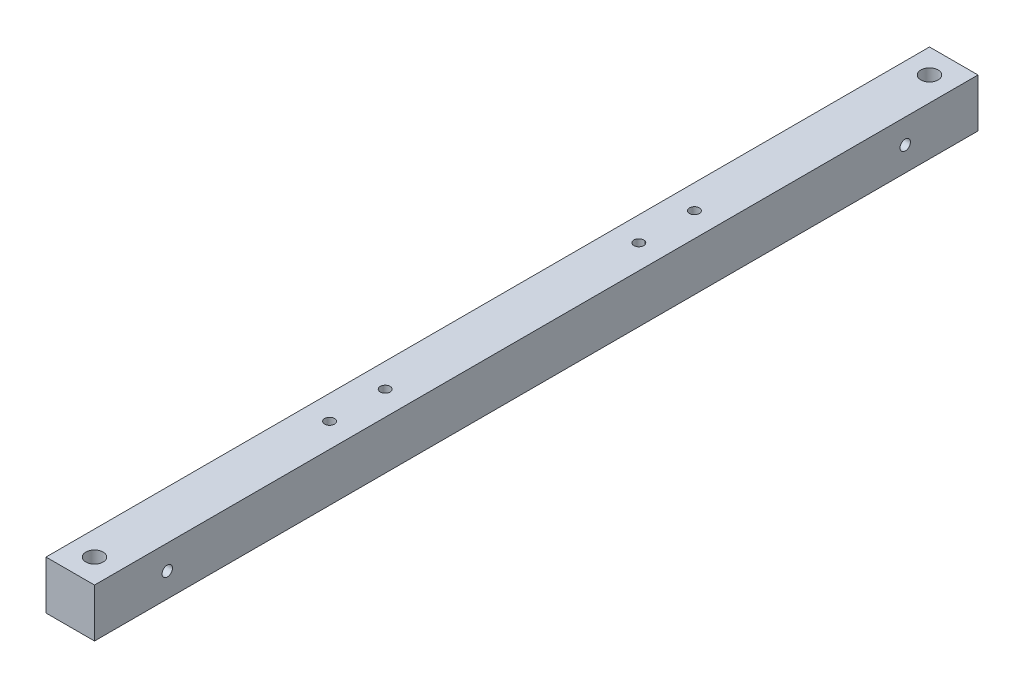
ISO-10303-21;
HEADER;
FILE_DESCRIPTION(('STEP AP214'),'2;1');
FILE_NAME('part.step','',(''),(''),'','','');
FILE_SCHEMA(('AUTOMOTIVE_DESIGN { 1 0 10303 214 1 1 1 1 }'));
ENDSEC;
DATA;
#1=APPLICATION_CONTEXT('core data for automotive mechanical design processes');
#2=APPLICATION_PROTOCOL_DEFINITION('international standard','automotive_design',2000,#1);
#3=PRODUCT_CONTEXT('',#1,'mechanical');
#4=PRODUCT('Part','Part','',(#3));
#5=PRODUCT_RELATED_PRODUCT_CATEGORY('part','',(#4));
#6=PRODUCT_DEFINITION_FORMATION('','',#4);
#7=PRODUCT_DEFINITION_CONTEXT('part definition',#1,'design');
#8=PRODUCT_DEFINITION('design','',#6,#7);
#9=PRODUCT_DEFINITION_SHAPE('','',#8);
#10=(LENGTH_UNIT() NAMED_UNIT(*) SI_UNIT(.MILLI.,.METRE.));
#11=(NAMED_UNIT(*) PLANE_ANGLE_UNIT() SI_UNIT($,.RADIAN.));
#12=(NAMED_UNIT(*) SI_UNIT($,.STERADIAN.) SOLID_ANGLE_UNIT());
#13=UNCERTAINTY_MEASURE_WITH_UNIT(LENGTH_MEASURE(1.E-05),#10,'distance_accuracy_value','');
#14=(GEOMETRIC_REPRESENTATION_CONTEXT(3) GLOBAL_UNCERTAINTY_ASSIGNED_CONTEXT((#13)) GLOBAL_UNIT_ASSIGNED_CONTEXT((#10,
#11,#12)) REPRESENTATION_CONTEXT('',''));
#15=CARTESIAN_POINT('',(0.,0.,0.));
#16=DIRECTION('',(0.,0.,1.));
#17=DIRECTION('',(1.,0.,0.));
#18=AXIS2_PLACEMENT_3D('',#15,#16,#17);
#19=CARTESIAN_POINT('',(0.,-14.,-241.));
#20=DIRECTION('',(0.,1.,0.));
#21=DIRECTION('',(0.,0.,1.));
#22=AXIS2_PLACEMENT_3D('',#19,#20,#21);
#23=CYLINDRICAL_SURFACE('',#22,3.);
#24=CARTESIAN_POINT('',(0.,-14.,-241.));
#25=DIRECTION('',(0.,1.,0.));
#26=DIRECTION('',(0.,0.,1.));
#27=AXIS2_PLACEMENT_3D('',#24,#25,#26);
#28=CIRCLE('',#27,3.);
#29=CARTESIAN_POINT('',(0.,-14.,-238.));
#30=VERTEX_POINT('',#29);
#31=EDGE_CURVE('E122',#30,#30,#28,.T.);
#32=ORIENTED_EDGE('',*,*,#31,.F.);
#33=EDGE_LOOP('',(#32));
#34=FACE_BOUND('',#33,.T.);
#35=CARTESIAN_POINT('',(0.,7.,-241.));
#36=DIRECTION('',(0.,1.,0.));
#37=DIRECTION('',(0.,0.,1.));
#38=AXIS2_PLACEMENT_3D('',#35,#36,#37);
#39=CIRCLE('',#38,3.);
#40=CARTESIAN_POINT('',(0.,7.,-238.));
#41=VERTEX_POINT('',#40);
#42=EDGE_CURVE('E37',#41,#41,#39,.F.);
#43=ORIENTED_EDGE('',*,*,#42,.F.);
#44=EDGE_LOOP('',(#43));
#45=FACE_BOUND('',#44,.T.);
#46=ADVANCED_FACE('F33',(#34,#45),#23,.F.);
#47=CARTESIAN_POINT('',(0.,-14.,241.));
#48=DIRECTION('',(0.,1.,0.));
#49=DIRECTION('',(0.,0.,1.));
#50=AXIS2_PLACEMENT_3D('',#47,#48,#49);
#51=CYLINDRICAL_SURFACE('',#50,3.);
#52=CARTESIAN_POINT('',(0.,-14.,241.));
#53=DIRECTION('',(0.,1.,0.));
#54=DIRECTION('',(0.,0.,1.));
#55=AXIS2_PLACEMENT_3D('',#52,#53,#54);
#56=CIRCLE('',#55,3.);
#57=CARTESIAN_POINT('',(0.,-14.,244.));
#58=VERTEX_POINT('',#57);
#59=EDGE_CURVE('E141',#58,#58,#56,.T.);
#60=ORIENTED_EDGE('',*,*,#59,.F.);
#61=EDGE_LOOP('',(#60));
#62=FACE_BOUND('',#61,.T.);
#63=CARTESIAN_POINT('',(0.,7.,241.));
#64=DIRECTION('',(0.,1.,0.));
#65=DIRECTION('',(0.,0.,1.));
#66=AXIS2_PLACEMENT_3D('',#63,#64,#65);
#67=CIRCLE('',#66,3.);
#68=CARTESIAN_POINT('',(0.,7.,244.));
#69=VERTEX_POINT('',#68);
#70=EDGE_CURVE('E116',#69,#69,#67,.F.);
#71=ORIENTED_EDGE('',*,*,#70,.F.);
#72=EDGE_LOOP('',(#71));
#73=FACE_BOUND('',#72,.T.);
#74=ADVANCED_FACE('F186',(#62,#73),#51,.F.);
#75=CARTESIAN_POINT('',(-26.,0.,213.));
#76=DIRECTION('',(1.,0.,0.));
#77=DIRECTION('',(0.,0.,-1.));
#78=AXIS2_PLACEMENT_3D('',#75,#76,#77);
#79=CYLINDRICAL_SURFACE('',#78,3.00000000000005);
#80=CARTESIAN_POINT('',(14.,0.,213.));
#81=DIRECTION('',(1.,0.,0.));
#82=DIRECTION('',(0.,0.,-1.));
#83=AXIS2_PLACEMENT_3D('',#80,#81,#82);
#84=CIRCLE('',#83,3.00000000000005);
#85=CARTESIAN_POINT('',(14.,0.,210.));
#86=VERTEX_POINT('',#85);
#87=EDGE_CURVE('E115',#86,#86,#84,.T.);
#88=ORIENTED_EDGE('',*,*,#87,.T.);
#89=EDGE_LOOP('',(#88));
#90=FACE_BOUND('',#89,.T.);
#91=CARTESIAN_POINT('',(-7.,0.,213.));
#92=DIRECTION('',(-1.,0.,0.));
#93=DIRECTION('',(0.,0.,1.));
#94=AXIS2_PLACEMENT_3D('',#91,#92,#93);
#95=CIRCLE('',#94,3.00000000000005);
#96=CARTESIAN_POINT('',(-7.,0.,216.));
#97=VERTEX_POINT('',#96);
#98=EDGE_CURVE('E112',#97,#97,#95,.F.);
#99=ORIENTED_EDGE('',*,*,#98,.F.);
#100=EDGE_LOOP('',(#99));
#101=FACE_BOUND('',#100,.T.);
#102=ADVANCED_FACE('F162',(#90,#101),#79,.F.);
#103=CARTESIAN_POINT('',(-26.,0.,-213.));
#104=DIRECTION('',(1.,0.,0.));
#105=DIRECTION('',(0.,0.,-1.));
#106=AXIS2_PLACEMENT_3D('',#103,#104,#105);
#107=CYLINDRICAL_SURFACE('',#106,2.99999999999999);
#108=CARTESIAN_POINT('',(14.,0.,-213.));
#109=DIRECTION('',(1.,0.,0.));
#110=DIRECTION('',(0.,0.,-1.));
#111=AXIS2_PLACEMENT_3D('',#108,#109,#110);
#112=CIRCLE('',#111,2.99999999999999);
#113=CARTESIAN_POINT('',(14.,0.,-216.));
#114=VERTEX_POINT('',#113);
#115=EDGE_CURVE('E103',#114,#114,#112,.T.);
#116=ORIENTED_EDGE('',*,*,#115,.T.);
#117=EDGE_LOOP('',(#116));
#118=FACE_BOUND('',#117,.T.);
#119=CARTESIAN_POINT('',(-7.,0.,-213.));
#120=DIRECTION('',(-1.,0.,0.));
#121=DIRECTION('',(0.,0.,1.));
#122=AXIS2_PLACEMENT_3D('',#119,#120,#121);
#123=CIRCLE('',#122,2.99999999999999);
#124=CARTESIAN_POINT('',(-7.,0.,-210.));
#125=VERTEX_POINT('',#124);
#126=EDGE_CURVE('E109',#125,#125,#123,.F.);
#127=ORIENTED_EDGE('',*,*,#126,.F.);
#128=EDGE_LOOP('',(#127));
#129=FACE_BOUND('',#128,.T.);
#130=ADVANCED_FACE('F167',(#118,#129),#107,.F.);
#131=CARTESIAN_POINT('',(14.,-14.,255.));
#132=DIRECTION('',(-1.,0.,0.));
#133=DIRECTION('',(0.,0.,1.));
#134=AXIS2_PLACEMENT_3D('',#131,#132,#133);
#135=PLANE('',#134);
#136=ORIENTED_EDGE('',*,*,#115,.F.);
#137=EDGE_LOOP('',(#136));
#138=FACE_BOUND('',#137,.T.);
#139=ORIENTED_EDGE('',*,*,#87,.F.);
#140=EDGE_LOOP('',(#139));
#141=FACE_BOUND('',#140,.T.);
#142=DIRECTION('',(0.,1.,0.));
#143=VECTOR('',#142,1.);
#144=CARTESIAN_POINT('',(14.,-14.,-255.));
#145=LINE('',#144,#143);
#146=CARTESIAN_POINT('',(14.,-14.,-255.));
#147=VERTEX_POINT('',#146);
#148=CARTESIAN_POINT('',(14.,14.,-255.));
#149=VERTEX_POINT('',#148);
#150=EDGE_CURVE('E100',#147,#149,#145,.T.);
#151=ORIENTED_EDGE('',*,*,#150,.T.);
#152=DIRECTION('',(0.,0.,-1.));
#153=VECTOR('',#152,1.);
#154=CARTESIAN_POINT('',(14.,14.,255.));
#155=LINE('',#154,#153);
#156=CARTESIAN_POINT('',(14.,14.,255.));
#157=VERTEX_POINT('',#156);
#158=EDGE_CURVE('E11',#157,#149,#155,.T.);
#159=ORIENTED_EDGE('',*,*,#158,.F.);
#160=DIRECTION('',(0.,1.,0.));
#161=VECTOR('',#160,1.);
#162=CARTESIAN_POINT('',(14.,-14.,255.));
#163=LINE('',#162,#161);
#164=CARTESIAN_POINT('',(14.,-14.,255.));
#165=VERTEX_POINT('',#164);
#166=EDGE_CURVE('E87',#165,#157,#163,.T.);
#167=ORIENTED_EDGE('',*,*,#166,.F.);
#168=DIRECTION('',(0.,0.,-1.));
#169=VECTOR('',#168,1.);
#170=CARTESIAN_POINT('',(14.,-14.,255.));
#171=LINE('',#170,#169);
#172=EDGE_CURVE('E96',#165,#147,#171,.T.);
#173=ORIENTED_EDGE('',*,*,#172,.T.);
#174=EDGE_LOOP('',(#151,#159,#167,#173));
#175=FACE_BOUND('',#174,.T.);
#176=ADVANCED_FACE('F35',(#138,#141,#175),#135,.F.);
#177=CARTESIAN_POINT('',(-14.,14.,255.));
#178=DIRECTION('',(0.,-1.,0.));
#179=DIRECTION('',(0.,0.,-1.));
#180=AXIS2_PLACEMENT_3D('',#177,#178,#179);
#181=PLANE('',#180);
#182=CARTESIAN_POINT('',(0.,14.,105.3));
#183=DIRECTION('',(0.,1.,0.));
#184=DIRECTION('',(0.,0.,1.));
#185=AXIS2_PLACEMENT_3D('',#182,#183,#184);
#186=CIRCLE('',#185,2.85);
#187=CARTESIAN_POINT('',(0.,14.,108.15));
#188=VERTEX_POINT('',#187);
#189=EDGE_CURVE('E375',#188,#188,#186,.T.);
#190=ORIENTED_EDGE('',*,*,#189,.F.);
#191=EDGE_LOOP('',(#190));
#192=FACE_BOUND('',#191,.T.);
#193=CARTESIAN_POINT('',(0.,14.,73.2));
#194=DIRECTION('',(0.,1.,0.));
#195=DIRECTION('',(0.,0.,1.));
#196=AXIS2_PLACEMENT_3D('',#193,#194,#195);
#197=CIRCLE('',#196,2.85);
#198=CARTESIAN_POINT('',(0.,14.,76.05));
#199=VERTEX_POINT('',#198);
#200=EDGE_CURVE('E380',#199,#199,#197,.T.);
#201=ORIENTED_EDGE('',*,*,#200,.F.);
#202=EDGE_LOOP('',(#201));
#203=FACE_BOUND('',#202,.T.);
#204=CARTESIAN_POINT('',(0.,14.,-73.2));
#205=DIRECTION('',(0.,1.,0.));
#206=DIRECTION('',(0.,0.,-1.));
#207=AXIS2_PLACEMENT_3D('',#204,#205,#206);
#208=CIRCLE('',#207,2.85);
#209=CARTESIAN_POINT('',(0.,14.,-76.05));
#210=VERTEX_POINT('',#209);
#211=EDGE_CURVE('E388',#210,#210,#208,.T.);
#212=ORIENTED_EDGE('',*,*,#211,.F.);
#213=EDGE_LOOP('',(#212));
#214=FACE_BOUND('',#213,.T.);
#215=CARTESIAN_POINT('',(0.,14.,-105.3));
#216=DIRECTION('',(0.,1.,0.));
#217=DIRECTION('',(0.,0.,-1.));
#218=AXIS2_PLACEMENT_3D('',#215,#216,#217);
#219=CIRCLE('',#218,2.85);
#220=CARTESIAN_POINT('',(0.,14.,-108.15));
#221=VERTEX_POINT('',#220);
#222=EDGE_CURVE('E132',#221,#221,#219,.T.);
#223=ORIENTED_EDGE('',*,*,#222,.F.);
#224=EDGE_LOOP('',(#223));
#225=FACE_BOUND('',#224,.T.);
#226=CARTESIAN_POINT('',(0.,14.,-241.));
#227=DIRECTION('',(0.,1.,0.));
#228=DIRECTION('',(0.,0.,1.));
#229=AXIS2_PLACEMENT_3D('',#226,#227,#228);
#230=CIRCLE('',#229,5.00000000000001);
#231=CARTESIAN_POINT('',(0.,14.,-236.));
#232=VERTEX_POINT('',#231);
#233=EDGE_CURVE('E124',#232,#232,#230,.T.);
#234=ORIENTED_EDGE('',*,*,#233,.F.);
#235=EDGE_LOOP('',(#234));
#236=FACE_BOUND('',#235,.T.);
#237=CARTESIAN_POINT('',(0.,14.,241.));
#238=DIRECTION('',(0.,1.,0.));
#239=DIRECTION('',(0.,0.,1.));
#240=AXIS2_PLACEMENT_3D('',#237,#238,#239);
#241=CIRCLE('',#240,5.00000000000001);
#242=CARTESIAN_POINT('',(0.,14.,246.));
#243=VERTEX_POINT('',#242);
#244=EDGE_CURVE('E137',#243,#243,#241,.T.);
#245=ORIENTED_EDGE('',*,*,#244,.F.);
#246=EDGE_LOOP('',(#245));
#247=FACE_BOUND('',#246,.T.);
#248=DIRECTION('',(-1.,0.,0.));
#249=VECTOR('',#248,1.);
#250=CARTESIAN_POINT('',(-14.,14.,-255.));
#251=LINE('',#250,#249);
#252=CARTESIAN_POINT('',(-14.,14.,-255.));
#253=VERTEX_POINT('',#252);
#254=EDGE_CURVE('E91',#149,#253,#251,.T.);
#255=ORIENTED_EDGE('',*,*,#254,.T.);
#256=DIRECTION('',(0.,0.,-1.));
#257=VECTOR('',#256,1.);
#258=CARTESIAN_POINT('',(-14.,14.,255.));
#259=LINE('',#258,#257);
#260=CARTESIAN_POINT('',(-14.,14.,255.));
#261=VERTEX_POINT('',#260);
#262=EDGE_CURVE('E43',#261,#253,#259,.T.);
#263=ORIENTED_EDGE('',*,*,#262,.F.);
#264=DIRECTION('',(-1.,0.,0.));
#265=VECTOR('',#264,1.);
#266=CARTESIAN_POINT('',(-14.,14.,255.));
#267=LINE('',#266,#265);
#268=EDGE_CURVE('E82',#157,#261,#267,.T.);
#269=ORIENTED_EDGE('',*,*,#268,.F.);
#270=ORIENTED_EDGE('',*,*,#158,.T.);
#271=EDGE_LOOP('',(#255,#263,#269,#270));
#272=FACE_BOUND('',#271,.T.);
#273=ADVANCED_FACE('F90',(#192,#203,#214,#225,#236,#247,#272),#181,.F.);
#274=CARTESIAN_POINT('',(-14.,-14.,255.));
#275=DIRECTION('',(1.,0.,0.));
#276=DIRECTION('',(0.,0.,-1.));
#277=AXIS2_PLACEMENT_3D('',#274,#275,#276);
#278=PLANE('',#277);
#279=CARTESIAN_POINT('',(-14.,0.,-213.));
#280=DIRECTION('',(-1.,0.,0.));
#281=DIRECTION('',(0.,0.,1.));
#282=AXIS2_PLACEMENT_3D('',#279,#280,#281);
#283=CIRCLE('',#282,4.99999999999999);
#284=CARTESIAN_POINT('',(-14.,0.,-208.));
#285=VERTEX_POINT('',#284);
#286=EDGE_CURVE('E149',#285,#285,#283,.T.);
#287=ORIENTED_EDGE('',*,*,#286,.F.);
#288=EDGE_LOOP('',(#287));
#289=FACE_BOUND('',#288,.T.);
#290=CARTESIAN_POINT('',(-14.,0.,213.));
#291=DIRECTION('',(-1.,0.,0.));
#292=DIRECTION('',(0.,0.,1.));
#293=AXIS2_PLACEMENT_3D('',#290,#291,#292);
#294=CIRCLE('',#293,5.00000000000005);
#295=CARTESIAN_POINT('',(-14.,0.,218.));
#296=VERTEX_POINT('',#295);
#297=EDGE_CURVE('E144',#296,#296,#294,.T.);
#298=ORIENTED_EDGE('',*,*,#297,.F.);
#299=EDGE_LOOP('',(#298));
#300=FACE_BOUND('',#299,.T.);
#301=DIRECTION('',(0.,-1.,0.));
#302=VECTOR('',#301,1.);
#303=CARTESIAN_POINT('',(-14.,-14.,-255.));
#304=LINE('',#303,#302);
#305=CARTESIAN_POINT('',(-14.,-14.,-255.));
#306=VERTEX_POINT('',#305);
#307=EDGE_CURVE('E69',#253,#306,#304,.T.);
#308=ORIENTED_EDGE('',*,*,#307,.T.);
#309=DIRECTION('',(0.,0.,-1.));
#310=VECTOR('',#309,1.);
#311=CARTESIAN_POINT('',(-14.,-14.,255.));
#312=LINE('',#311,#310);
#313=CARTESIAN_POINT('',(-14.,-14.,255.));
#314=VERTEX_POINT('',#313);
#315=EDGE_CURVE('E92',#314,#306,#312,.T.);
#316=ORIENTED_EDGE('',*,*,#315,.F.);
#317=DIRECTION('',(0.,-1.,0.));
#318=VECTOR('',#317,1.);
#319=CARTESIAN_POINT('',(-14.,-14.,255.));
#320=LINE('',#319,#318);
#321=EDGE_CURVE('E85',#261,#314,#320,.T.);
#322=ORIENTED_EDGE('',*,*,#321,.F.);
#323=ORIENTED_EDGE('',*,*,#262,.T.);
#324=EDGE_LOOP('',(#308,#316,#322,#323));
#325=FACE_BOUND('',#324,.T.);
#326=ADVANCED_FACE('F94',(#289,#300,#325),#278,.F.);
#327=CARTESIAN_POINT('',(-14.,-14.,255.));
#328=DIRECTION('',(0.,1.,0.));
#329=DIRECTION('',(0.,0.,1.));
#330=AXIS2_PLACEMENT_3D('',#327,#328,#329);
#331=PLANE('',#330);
#332=CARTESIAN_POINT('',(0.,-14.,105.3));
#333=DIRECTION('',(0.,1.,0.));
#334=DIRECTION('',(0.,0.,1.));
#335=AXIS2_PLACEMENT_3D('',#332,#333,#334);
#336=CIRCLE('',#335,2.85);
#337=CARTESIAN_POINT('',(0.,-14.,108.15));
#338=VERTEX_POINT('',#337);
#339=EDGE_CURVE('E140',#338,#338,#336,.T.);
#340=ORIENTED_EDGE('',*,*,#339,.T.);
#341=EDGE_LOOP('',(#340));
#342=FACE_BOUND('',#341,.T.);
#343=CARTESIAN_POINT('',(0.,-14.,73.2));
#344=DIRECTION('',(0.,1.,0.));
#345=DIRECTION('',(0.,0.,1.));
#346=AXIS2_PLACEMENT_3D('',#343,#344,#345);
#347=CIRCLE('',#346,2.85);
#348=CARTESIAN_POINT('',(0.,-14.,76.05));
#349=VERTEX_POINT('',#348);
#350=EDGE_CURVE('E376',#349,#349,#347,.T.);
#351=ORIENTED_EDGE('',*,*,#350,.T.);
#352=EDGE_LOOP('',(#351));
#353=FACE_BOUND('',#352,.T.);
#354=CARTESIAN_POINT('',(0.,-14.,-73.2));
#355=DIRECTION('',(0.,1.,0.));
#356=DIRECTION('',(0.,0.,-1.));
#357=AXIS2_PLACEMENT_3D('',#354,#355,#356);
#358=CIRCLE('',#357,2.85);
#359=CARTESIAN_POINT('',(0.,-14.,-76.05));
#360=VERTEX_POINT('',#359);
#361=EDGE_CURVE('E385',#360,#360,#358,.T.);
#362=ORIENTED_EDGE('',*,*,#361,.T.);
#363=EDGE_LOOP('',(#362));
#364=FACE_BOUND('',#363,.T.);
#365=CARTESIAN_POINT('',(0.,-14.,-105.3));
#366=DIRECTION('',(0.,1.,0.));
#367=DIRECTION('',(0.,0.,-1.));
#368=AXIS2_PLACEMENT_3D('',#365,#366,#367);
#369=CIRCLE('',#368,2.85);
#370=CARTESIAN_POINT('',(0.,-14.,-108.15));
#371=VERTEX_POINT('',#370);
#372=EDGE_CURVE('E390',#371,#371,#369,.T.);
#373=ORIENTED_EDGE('',*,*,#372,.T.);
#374=EDGE_LOOP('',(#373));
#375=FACE_BOUND('',#374,.T.);
#376=ORIENTED_EDGE('',*,*,#59,.T.);
#377=EDGE_LOOP('',(#376));
#378=FACE_BOUND('',#377,.T.);
#379=ORIENTED_EDGE('',*,*,#31,.T.);
#380=EDGE_LOOP('',(#379));
#381=FACE_BOUND('',#380,.T.);
#382=DIRECTION('',(1.,0.,0.));
#383=VECTOR('',#382,1.);
#384=CARTESIAN_POINT('',(-14.,-14.,-255.));
#385=LINE('',#384,#383);
#386=EDGE_CURVE('E75',#306,#147,#385,.T.);
#387=ORIENTED_EDGE('',*,*,#386,.T.);
#388=ORIENTED_EDGE('',*,*,#172,.F.);
#389=DIRECTION('',(1.,0.,0.));
#390=VECTOR('',#389,1.);
#391=CARTESIAN_POINT('',(-14.,-14.,255.));
#392=LINE('',#391,#390);
#393=EDGE_CURVE('E52',#314,#165,#392,.T.);
#394=ORIENTED_EDGE('',*,*,#393,.F.);
#395=ORIENTED_EDGE('',*,*,#315,.T.);
#396=EDGE_LOOP('',(#387,#388,#394,#395));
#397=FACE_BOUND('',#396,.T.);
#398=ADVANCED_FACE('F182',(#342,#353,#364,#375,#378,#381,#397),#331,.F.);
#399=CARTESIAN_POINT('',(0.,0.,255.));
#400=DIRECTION('',(0.,0.,-1.));
#401=DIRECTION('',(-1.,0.,0.));
#402=AXIS2_PLACEMENT_3D('',#399,#400,#401);
#403=PLANE('',#402);
#404=ORIENTED_EDGE('',*,*,#166,.T.);
#405=ORIENTED_EDGE('',*,*,#268,.T.);
#406=ORIENTED_EDGE('',*,*,#321,.T.);
#407=ORIENTED_EDGE('',*,*,#393,.T.);
#408=EDGE_LOOP('',(#404,#405,#406,#407));
#409=FACE_BOUND('',#408,.T.);
#410=ADVANCED_FACE('F83',(#409),#403,.F.);
#411=CARTESIAN_POINT('',(0.,0.,-255.));
#412=DIRECTION('',(0.,0.,-1.));
#413=DIRECTION('',(-1.,0.,0.));
#414=AXIS2_PLACEMENT_3D('',#411,#412,#413);
#415=PLANE('',#414);
#416=ORIENTED_EDGE('',*,*,#150,.F.);
#417=ORIENTED_EDGE('',*,*,#386,.F.);
#418=ORIENTED_EDGE('',*,*,#307,.F.);
#419=ORIENTED_EDGE('',*,*,#254,.F.);
#420=EDGE_LOOP('',(#416,#417,#418,#419));
#421=FACE_BOUND('',#420,.T.);
#422=ADVANCED_FACE('F171',(#421),#415,.T.);
#423=CARTESIAN_POINT('',(-7.,0.,-213.));
#424=DIRECTION('',(-1.,0.,0.));
#425=DIRECTION('',(0.,0.,1.));
#426=AXIS2_PLACEMENT_3D('',#423,#424,#425);
#427=PLANE('',#426);
#428=CARTESIAN_POINT('',(-7.,0.,-213.));
#429=DIRECTION('',(-1.,0.,0.));
#430=DIRECTION('',(0.,0.,1.));
#431=AXIS2_PLACEMENT_3D('',#428,#429,#430);
#432=CIRCLE('',#431,4.99999999999999);
#433=CARTESIAN_POINT('',(-7.,0.,-208.));
#434=VERTEX_POINT('',#433);
#435=EDGE_CURVE('E113',#434,#434,#432,.T.);
#436=ORIENTED_EDGE('',*,*,#435,.T.);
#437=EDGE_LOOP('',(#436));
#438=FACE_BOUND('',#437,.T.);
#439=ORIENTED_EDGE('',*,*,#126,.T.);
#440=EDGE_LOOP('',(#439));
#441=FACE_BOUND('',#440,.T.);
#442=ADVANCED_FACE('F173',(#438,#441),#427,.T.);
#443=CARTESIAN_POINT('',(-7.,0.,-213.));
#444=DIRECTION('',(-1.,0.,0.));
#445=DIRECTION('',(0.,0.,1.));
#446=AXIS2_PLACEMENT_3D('',#443,#444,#445);
#447=CYLINDRICAL_SURFACE('',#446,4.99999999999999);
#448=ORIENTED_EDGE('',*,*,#435,.F.);
#449=EDGE_LOOP('',(#448));
#450=FACE_BOUND('',#449,.T.);
#451=ORIENTED_EDGE('',*,*,#286,.T.);
#452=EDGE_LOOP('',(#451));
#453=FACE_BOUND('',#452,.T.);
#454=ADVANCED_FACE('F179',(#450,#453),#447,.F.);
#455=CARTESIAN_POINT('',(-7.,0.,213.));
#456=DIRECTION('',(-1.,0.,0.));
#457=DIRECTION('',(0.,0.,1.));
#458=AXIS2_PLACEMENT_3D('',#455,#456,#457);
#459=PLANE('',#458);
#460=CARTESIAN_POINT('',(-7.,0.,213.));
#461=DIRECTION('',(-1.,0.,0.));
#462=DIRECTION('',(0.,0.,1.));
#463=AXIS2_PLACEMENT_3D('',#460,#461,#462);
#464=CIRCLE('',#463,5.00000000000005);
#465=CARTESIAN_POINT('',(-7.,0.,218.));
#466=VERTEX_POINT('',#465);
#467=EDGE_CURVE('E152',#466,#466,#464,.T.);
#468=ORIENTED_EDGE('',*,*,#467,.T.);
#469=EDGE_LOOP('',(#468));
#470=FACE_BOUND('',#469,.T.);
#471=ORIENTED_EDGE('',*,*,#98,.T.);
#472=EDGE_LOOP('',(#471));
#473=FACE_BOUND('',#472,.T.);
#474=ADVANCED_FACE('F200',(#470,#473),#459,.T.);
#475=CARTESIAN_POINT('',(-7.,0.,213.));
#476=DIRECTION('',(-1.,0.,0.));
#477=DIRECTION('',(0.,0.,1.));
#478=AXIS2_PLACEMENT_3D('',#475,#476,#477);
#479=CYLINDRICAL_SURFACE('',#478,5.00000000000005);
#480=ORIENTED_EDGE('',*,*,#467,.F.);
#481=EDGE_LOOP('',(#480));
#482=FACE_BOUND('',#481,.T.);
#483=ORIENTED_EDGE('',*,*,#297,.T.);
#484=EDGE_LOOP('',(#483));
#485=FACE_BOUND('',#484,.T.);
#486=ADVANCED_FACE('F204',(#482,#485),#479,.F.);
#487=CARTESIAN_POINT('',(0.,7.,241.));
#488=DIRECTION('',(0.,1.,0.));
#489=DIRECTION('',(0.,0.,1.));
#490=AXIS2_PLACEMENT_3D('',#487,#488,#489);
#491=PLANE('',#490);
#492=CARTESIAN_POINT('',(0.,7.,241.));
#493=DIRECTION('',(0.,1.,0.));
#494=DIRECTION('',(0.,0.,1.));
#495=AXIS2_PLACEMENT_3D('',#492,#493,#494);
#496=CIRCLE('',#495,5.00000000000001);
#497=CARTESIAN_POINT('',(0.,7.,246.));
#498=VERTEX_POINT('',#497);
#499=EDGE_CURVE('E129',#498,#498,#496,.T.);
#500=ORIENTED_EDGE('',*,*,#499,.T.);
#501=EDGE_LOOP('',(#500));
#502=FACE_BOUND('',#501,.T.);
#503=ORIENTED_EDGE('',*,*,#70,.T.);
#504=EDGE_LOOP('',(#503));
#505=FACE_BOUND('',#504,.T.);
#506=ADVANCED_FACE('F208',(#502,#505),#491,.T.);
#507=CARTESIAN_POINT('',(0.,7.,241.));
#508=DIRECTION('',(0.,1.,0.));
#509=DIRECTION('',(0.,0.,1.));
#510=AXIS2_PLACEMENT_3D('',#507,#508,#509);
#511=CYLINDRICAL_SURFACE('',#510,5.00000000000001);
#512=ORIENTED_EDGE('',*,*,#499,.F.);
#513=EDGE_LOOP('',(#512));
#514=FACE_BOUND('',#513,.T.);
#515=ORIENTED_EDGE('',*,*,#244,.T.);
#516=EDGE_LOOP('',(#515));
#517=FACE_BOUND('',#516,.T.);
#518=ADVANCED_FACE('F297',(#514,#517),#511,.F.);
#519=CARTESIAN_POINT('',(0.,7.,-241.));
#520=DIRECTION('',(0.,1.,0.));
#521=DIRECTION('',(0.,0.,1.));
#522=AXIS2_PLACEMENT_3D('',#519,#520,#521);
#523=PLANE('',#522);
#524=CARTESIAN_POINT('',(0.,7.,-241.));
#525=DIRECTION('',(0.,1.,0.));
#526=DIRECTION('',(0.,0.,1.));
#527=AXIS2_PLACEMENT_3D('',#524,#525,#526);
#528=CIRCLE('',#527,5.00000000000001);
#529=CARTESIAN_POINT('',(0.,7.,-236.));
#530=VERTEX_POINT('',#529);
#531=EDGE_CURVE('E118',#530,#530,#528,.T.);
#532=ORIENTED_EDGE('',*,*,#531,.T.);
#533=EDGE_LOOP('',(#532));
#534=FACE_BOUND('',#533,.T.);
#535=ORIENTED_EDGE('',*,*,#42,.T.);
#536=EDGE_LOOP('',(#535));
#537=FACE_BOUND('',#536,.T.);
#538=ADVANCED_FACE('F306',(#534,#537),#523,.T.);
#539=CARTESIAN_POINT('',(0.,7.,-241.));
#540=DIRECTION('',(0.,1.,0.));
#541=DIRECTION('',(0.,0.,1.));
#542=AXIS2_PLACEMENT_3D('',#539,#540,#541);
#543=CYLINDRICAL_SURFACE('',#542,5.00000000000001);
#544=ORIENTED_EDGE('',*,*,#531,.F.);
#545=EDGE_LOOP('',(#544));
#546=FACE_BOUND('',#545,.T.);
#547=ORIENTED_EDGE('',*,*,#233,.T.);
#548=EDGE_LOOP('',(#547));
#549=FACE_BOUND('',#548,.T.);
#550=ADVANCED_FACE('F314',(#546,#549),#543,.F.);
#551=CARTESIAN_POINT('',(0.,-14.,-105.3));
#552=DIRECTION('',(0.,1.,0.));
#553=DIRECTION('',(0.,0.,1.));
#554=AXIS2_PLACEMENT_3D('',#551,#552,#553);
#555=CYLINDRICAL_SURFACE('',#554,2.85);
#556=ORIENTED_EDGE('',*,*,#372,.F.);
#557=EDGE_LOOP('',(#556));
#558=FACE_BOUND('',#557,.T.);
#559=ORIENTED_EDGE('',*,*,#222,.T.);
#560=EDGE_LOOP('',(#559));
#561=FACE_BOUND('',#560,.T.);
#562=ADVANCED_FACE('F321',(#558,#561),#555,.F.);
#563=CARTESIAN_POINT('',(0.,-14.,-73.2));
#564=DIRECTION('',(0.,1.,0.));
#565=DIRECTION('',(0.,0.,1.));
#566=AXIS2_PLACEMENT_3D('',#563,#564,#565);
#567=CYLINDRICAL_SURFACE('',#566,2.85);
#568=ORIENTED_EDGE('',*,*,#361,.F.);
#569=EDGE_LOOP('',(#568));
#570=FACE_BOUND('',#569,.T.);
#571=ORIENTED_EDGE('',*,*,#211,.T.);
#572=EDGE_LOOP('',(#571));
#573=FACE_BOUND('',#572,.T.);
#574=ADVANCED_FACE('F329',(#570,#573),#567,.F.);
#575=CARTESIAN_POINT('',(0.,-14.,73.2));
#576=DIRECTION('',(0.,1.,0.));
#577=DIRECTION('',(0.,0.,1.));
#578=AXIS2_PLACEMENT_3D('',#575,#576,#577);
#579=CYLINDRICAL_SURFACE('',#578,2.85);
#580=ORIENTED_EDGE('',*,*,#350,.F.);
#581=EDGE_LOOP('',(#580));
#582=FACE_BOUND('',#581,.T.);
#583=ORIENTED_EDGE('',*,*,#200,.T.);
#584=EDGE_LOOP('',(#583));
#585=FACE_BOUND('',#584,.T.);
#586=ADVANCED_FACE('F338',(#582,#585),#579,.F.);
#587=CARTESIAN_POINT('',(0.,-14.,105.3));
#588=DIRECTION('',(0.,1.,0.));
#589=DIRECTION('',(0.,0.,1.));
#590=AXIS2_PLACEMENT_3D('',#587,#588,#589);
#591=CYLINDRICAL_SURFACE('',#590,2.85);
#592=ORIENTED_EDGE('',*,*,#339,.F.);
#593=EDGE_LOOP('',(#592));
#594=FACE_BOUND('',#593,.T.);
#595=ORIENTED_EDGE('',*,*,#189,.T.);
#596=EDGE_LOOP('',(#595));
#597=FACE_BOUND('',#596,.T.);
#598=ADVANCED_FACE('F347',(#594,#597),#591,.F.);
#599=CLOSED_SHELL('',(#46,#74,#102,#130,#176,#273,#326,#398,#410,#422,#442,#454,#474,#486,#506,
#518,#538,#550,#562,#574,#586,#598));
#600=MANIFOLD_SOLID_BREP('B2',#599);
#601=ADVANCED_BREP_SHAPE_REPRESENTATION('',(#18,#600),#14);
#602=SHAPE_DEFINITION_REPRESENTATION(#9,#601);
ENDSEC;
END-ISO-10303-21;
